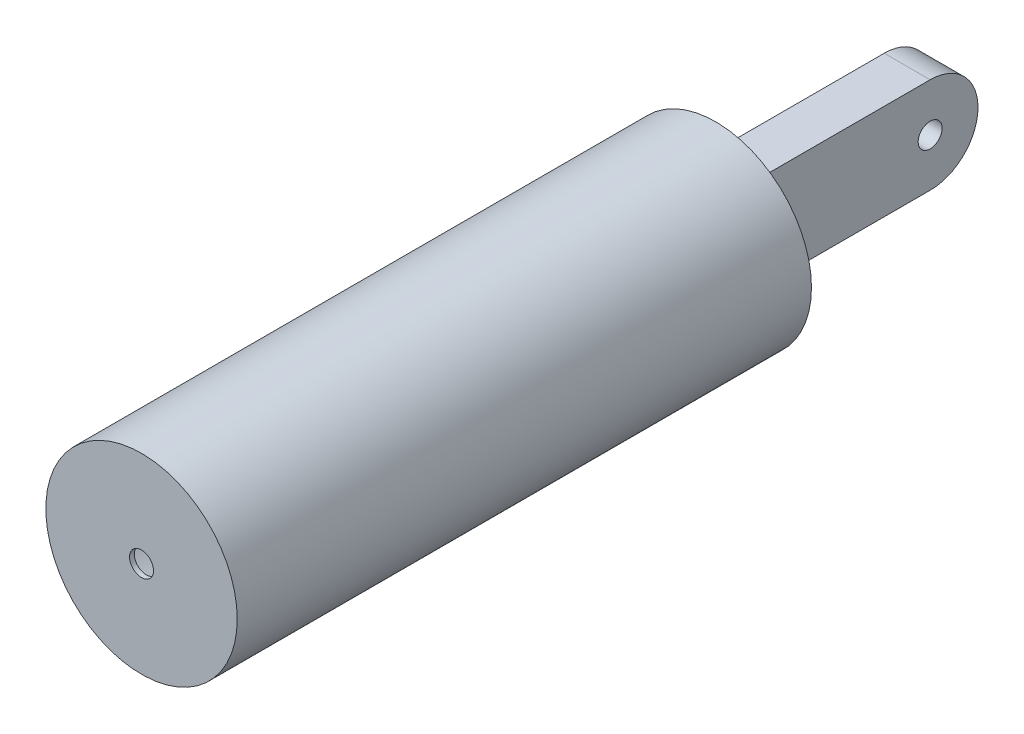
ISO-10303-21;
HEADER;
FILE_DESCRIPTION(('STEP AP214'),'2;1');
FILE_NAME('part.step','',(''),(''),'','','');
FILE_SCHEMA(('AUTOMOTIVE_DESIGN { 1 0 10303 214 1 1 1 1 }'));
ENDSEC;
DATA;
#1=APPLICATION_CONTEXT('core data for automotive mechanical design processes');
#2=APPLICATION_PROTOCOL_DEFINITION('international standard','automotive_design',2000,#1);
#3=PRODUCT_CONTEXT('',#1,'mechanical');
#4=PRODUCT('Part','Part','',(#3));
#5=PRODUCT_RELATED_PRODUCT_CATEGORY('part','',(#4));
#6=PRODUCT_DEFINITION_FORMATION('','',#4);
#7=PRODUCT_DEFINITION_CONTEXT('part definition',#1,'design');
#8=PRODUCT_DEFINITION('design','',#6,#7);
#9=PRODUCT_DEFINITION_SHAPE('','',#8);
#10=(LENGTH_UNIT() NAMED_UNIT(*) SI_UNIT(.MILLI.,.METRE.));
#11=(NAMED_UNIT(*) PLANE_ANGLE_UNIT() SI_UNIT($,.RADIAN.));
#12=(NAMED_UNIT(*) SI_UNIT($,.STERADIAN.) SOLID_ANGLE_UNIT());
#13=UNCERTAINTY_MEASURE_WITH_UNIT(LENGTH_MEASURE(1.E-05),#10,'distance_accuracy_value','');
#14=(GEOMETRIC_REPRESENTATION_CONTEXT(3) GLOBAL_UNCERTAINTY_ASSIGNED_CONTEXT((#13)) GLOBAL_UNIT_ASSIGNED_CONTEXT((#10,
#11,#12)) REPRESENTATION_CONTEXT('',''));
#15=CARTESIAN_POINT('',(0.,0.,0.));
#16=DIRECTION('',(0.,0.,1.));
#17=DIRECTION('',(1.,0.,0.));
#18=AXIS2_PLACEMENT_3D('',#15,#16,#17);
#19=CARTESIAN_POINT('',(0.,0.,-29.5));
#20=DIRECTION('',(0.,0.,1.));
#21=DIRECTION('',(1.,0.,0.));
#22=AXIS2_PLACEMENT_3D('',#19,#20,#21);
#23=CYLINDRICAL_SURFACE('',#22,9.75);
#24=CARTESIAN_POINT('',(0.,0.,-29.5));
#25=DIRECTION('',(0.,0.,1.));
#26=DIRECTION('',(1.,0.,0.));
#27=AXIS2_PLACEMENT_3D('',#24,#25,#26);
#28=CIRCLE('',#27,9.75);
#29=CARTESIAN_POINT('',(9.75,0.,-29.5));
#30=VERTEX_POINT('',#29);
#31=EDGE_CURVE('E118',#30,#30,#28,.T.);
#32=CARTESIAN_POINT('',(0.,0.,29.5));
#33=DIRECTION('',(0.,0.,1.));
#34=DIRECTION('',(1.,0.,0.));
#35=AXIS2_PLACEMENT_3D('',#32,#33,#34);
#36=CIRCLE('',#35,9.75);
#37=CARTESIAN_POINT('',(9.75,0.,29.5));
#38=VERTEX_POINT('',#37);
#39=EDGE_CURVE('E121',#38,#38,#36,.T.);
#40=CARTESIAN_POINT('',(9.75,0.,-29.5));
#41=CARTESIAN_POINT('',(9.75,0.,-28.8854166666667));
#42=CARTESIAN_POINT('',(9.75,0.,-28.2708333333333));
#43=CARTESIAN_POINT('',(9.75,0.,-27.0416666666667));
#44=CARTESIAN_POINT('',(9.75,0.,-26.4270833333333));
#45=CARTESIAN_POINT('',(9.75,0.,-25.1979166666667));
#46=CARTESIAN_POINT('',(9.75,0.,-24.5833333333333));
#47=CARTESIAN_POINT('',(9.75,0.,-23.3541666666667));
#48=CARTESIAN_POINT('',(9.75,0.,-22.7395833333333));
#49=CARTESIAN_POINT('',(9.75,0.,-21.5104166666667));
#50=CARTESIAN_POINT('',(9.75,0.,-20.8958333333333));
#51=CARTESIAN_POINT('',(9.75,0.,-19.6666666666667));
#52=CARTESIAN_POINT('',(9.75,0.,-19.0520833333333));
#53=CARTESIAN_POINT('',(9.75,0.,-17.8229166666667));
#54=CARTESIAN_POINT('',(9.75,0.,-17.2083333333333));
#55=CARTESIAN_POINT('',(9.75,0.,-15.9791666666667));
#56=CARTESIAN_POINT('',(9.75,0.,-15.3645833333333));
#57=CARTESIAN_POINT('',(9.75,0.,-14.1354166666667));
#58=CARTESIAN_POINT('',(9.75,0.,-13.5208333333333));
#59=CARTESIAN_POINT('',(9.75,0.,-12.2916666666667));
#60=CARTESIAN_POINT('',(9.75,0.,-11.6770833333333));
#61=CARTESIAN_POINT('',(9.75,0.,-10.4479166666667));
#62=CARTESIAN_POINT('',(9.75,0.,-9.83333333333333));
#63=CARTESIAN_POINT('',(9.75,0.,-8.60416666666667));
#64=CARTESIAN_POINT('',(9.75,0.,-7.98958333333333));
#65=CARTESIAN_POINT('',(9.75,0.,-6.76041666666667));
#66=CARTESIAN_POINT('',(9.75,0.,-6.14583333333333));
#67=CARTESIAN_POINT('',(9.75,0.,-4.91666666666667));
#68=CARTESIAN_POINT('',(9.75,0.,-4.30208333333333));
#69=CARTESIAN_POINT('',(9.75,0.,-3.07291666666667));
#70=CARTESIAN_POINT('',(9.75,0.,-2.45833333333333));
#71=CARTESIAN_POINT('',(9.75,0.,-1.22916666666667));
#72=CARTESIAN_POINT('',(9.75,0.,-0.614583333333334));
#73=CARTESIAN_POINT('',(9.75,0.,0.614583333333332));
#74=CARTESIAN_POINT('',(9.75,0.,1.22916666666666));
#75=CARTESIAN_POINT('',(9.75,0.,2.45833333333333));
#76=CARTESIAN_POINT('',(9.75,0.,3.07291666666666));
#77=CARTESIAN_POINT('',(9.75,0.,4.30208333333333));
#78=CARTESIAN_POINT('',(9.75,0.,4.91666666666667));
#79=CARTESIAN_POINT('',(9.75,0.,6.14583333333333));
#80=CARTESIAN_POINT('',(9.75,0.,6.76041666666666));
#81=CARTESIAN_POINT('',(9.75,0.,7.98958333333333));
#82=CARTESIAN_POINT('',(9.75,0.,8.60416666666667));
#83=CARTESIAN_POINT('',(9.75,0.,9.83333333333333));
#84=CARTESIAN_POINT('',(9.75,0.,10.4479166666667));
#85=CARTESIAN_POINT('',(9.75,0.,11.6770833333333));
#86=CARTESIAN_POINT('',(9.75,0.,12.2916666666667));
#87=CARTESIAN_POINT('',(9.75,0.,13.5208333333333));
#88=CARTESIAN_POINT('',(9.75,0.,14.1354166666667));
#89=CARTESIAN_POINT('',(9.75,0.,15.3645833333333));
#90=CARTESIAN_POINT('',(9.75,0.,15.9791666666667));
#91=CARTESIAN_POINT('',(9.75,0.,17.2083333333333));
#92=CARTESIAN_POINT('',(9.75,0.,17.8229166666667));
#93=CARTESIAN_POINT('',(9.75,0.,19.0520833333333));
#94=CARTESIAN_POINT('',(9.75,0.,19.6666666666667));
#95=CARTESIAN_POINT('',(9.75,0.,20.8958333333333));
#96=CARTESIAN_POINT('',(9.75,0.,21.5104166666667));
#97=CARTESIAN_POINT('',(9.75,0.,22.7395833333333));
#98=CARTESIAN_POINT('',(9.75,0.,23.3541666666667));
#99=CARTESIAN_POINT('',(9.75,0.,24.5833333333333));
#100=CARTESIAN_POINT('',(9.75,0.,25.1979166666667));
#101=CARTESIAN_POINT('',(9.75,0.,26.4270833333333));
#102=CARTESIAN_POINT('',(9.75,0.,27.0416666666667));
#103=CARTESIAN_POINT('',(9.75,0.,28.2708333333333));
#104=CARTESIAN_POINT('',(9.75,0.,28.8854166666667));
#105=CARTESIAN_POINT('',(9.75,0.,29.5));
#106=B_SPLINE_CURVE_WITH_KNOTS('',3,(#40,#41,#42,#43,#44,#45,#46,#47,#48,#49,#50,#51,#52,#53,
#54,#55,#56,#57,#58,#59,#60,#61,#62,#63,#64,#65,#66,#67,#68,#69,#70,#71,#72,#73,#74,#75,#76,#77,
#78,#79,#80,#81,#82,#83,#84,#85,#86,#87,#88,#89,#90,#91,#92,#93,#94,#95,#96,#97,#98,#99,#100,
#101,#102,#103,#104,#105),.UNSPECIFIED.,.F.,.F.,(4,2,2,2,2,2,2,2,2,2,2,2,2,2,2,2,2,2,2,2,2,2,2,
2,2,2,2,2,2,2,2,2,4),(0.,1.84375,3.6875,5.53125,7.375,9.21875,11.0625,12.90625,14.75,16.59375,
18.4375,20.28125,22.125,23.96875,25.8125,27.65625,29.5,31.34375,33.1875,35.03125,36.875,
38.71875,40.5625,42.40625,44.25,46.09375,47.9375,49.78125,51.625,53.46875,55.3125,57.15625,59.),.UNSPECIFIED.);
#107=EDGE_CURVE('BSEAM38',#30,#38,#106,.T.);
#108=ORIENTED_EDGE('',*,*,#31,.F.);
#109=ORIENTED_EDGE('',*,*,#39,.T.);
#110=ORIENTED_EDGE('',*,*,#107,.T.);
#111=ORIENTED_EDGE('',*,*,#107,.F.);
#112=EDGE_LOOP('',(#108,#110,#109,#111));
#113=FACE_BOUND('',#112,.T.);
#114=ADVANCED_FACE('F38',(#113),#23,.F.);
#115=CARTESIAN_POINT('',(0.,0.,-29.5));
#116=DIRECTION('',(0.,0.,1.));
#117=DIRECTION('',(1.,0.,0.));
#118=AXIS2_PLACEMENT_3D('',#115,#116,#117);
#119=PLANE('',#118);
#120=ORIENTED_EDGE('',*,*,#31,.T.);
#121=EDGE_LOOP('',(#120));
#122=FACE_BOUND('',#121,.T.);
#123=ADVANCED_FACE('F141',(#122),#119,.T.);
#124=CARTESIAN_POINT('',(0.,0.,29.5));
#125=DIRECTION('',(0.,0.,1.));
#126=DIRECTION('',(1.,0.,0.));
#127=AXIS2_PLACEMENT_3D('',#124,#125,#126);
#128=PLANE('',#127);
#129=CARTESIAN_POINT('',(0.,0.,29.5));
#130=DIRECTION('',(0.,0.,1.));
#131=DIRECTION('',(1.,0.,0.));
#132=AXIS2_PLACEMENT_3D('',#129,#130,#131);
#133=CIRCLE('',#132,1.25);
#134=CARTESIAN_POINT('',(1.25,0.,29.5));
#135=VERTEX_POINT('',#134);
#136=EDGE_CURVE('E117',#135,#135,#133,.T.);
#137=ORIENTED_EDGE('',*,*,#136,.T.);
#138=EDGE_LOOP('',(#137));
#139=FACE_BOUND('',#138,.T.);
#140=ORIENTED_EDGE('',*,*,#39,.F.);
#141=EDGE_LOOP('',(#140));
#142=FACE_BOUND('',#141,.T.);
#143=ADVANCED_FACE('F128',(#139,#142),#128,.F.);
#144=CARTESIAN_POINT('',(0.,0.,29.));
#145=DIRECTION('',(0.,0.,1.));
#146=DIRECTION('',(1.,0.,0.));
#147=AXIS2_PLACEMENT_3D('',#144,#145,#146);
#148=CYLINDRICAL_SURFACE('',#147,1.25);
#149=CARTESIAN_POINT('',(0.,0.,30.));
#150=DIRECTION('',(0.,0.,1.));
#151=DIRECTION('',(1.,0.,0.));
#152=AXIS2_PLACEMENT_3D('',#149,#150,#151);
#153=CIRCLE('',#152,1.25);
#154=CARTESIAN_POINT('',(1.25,0.,30.));
#155=VERTEX_POINT('',#154);
#156=EDGE_CURVE('E114',#155,#155,#153,.T.);
#157=ORIENTED_EDGE('',*,*,#156,.T.);
#158=EDGE_LOOP('',(#157));
#159=FACE_BOUND('',#158,.T.);
#160=ORIENTED_EDGE('',*,*,#136,.F.);
#161=EDGE_LOOP('',(#160));
#162=FACE_BOUND('',#161,.T.);
#163=ADVANCED_FACE('F131',(#159,#162),#148,.F.);
#164=CARTESIAN_POINT('',(0.,0.,30.));
#165=DIRECTION('',(0.,0.,-1.));
#166=DIRECTION('',(-1.,0.,0.));
#167=AXIS2_PLACEMENT_3D('',#164,#165,#166);
#168=CYLINDRICAL_SURFACE('',#167,10.);
#169=CARTESIAN_POINT('',(0.,0.,30.));
#170=DIRECTION('',(0.,0.,1.));
#171=DIRECTION('',(1.,0.,0.));
#172=AXIS2_PLACEMENT_3D('',#169,#170,#171);
#173=CIRCLE('',#172,10.);
#174=CARTESIAN_POINT('',(10.,0.,30.));
#175=VERTEX_POINT('',#174);
#176=EDGE_CURVE('E11',#175,#175,#173,.T.);
#177=ORIENTED_EDGE('',*,*,#176,.F.);
#178=EDGE_LOOP('',(#177));
#179=FACE_BOUND('',#178,.T.);
#180=CARTESIAN_POINT('',(0.,0.,-30.));
#181=DIRECTION('',(0.,0.,1.));
#182=DIRECTION('',(1.,0.,0.));
#183=AXIS2_PLACEMENT_3D('',#180,#181,#182);
#184=CIRCLE('',#183,10.);
#185=CARTESIAN_POINT('',(10.,0.,-30.));
#186=VERTEX_POINT('',#185);
#187=EDGE_CURVE('E47',#186,#186,#184,.T.);
#188=ORIENTED_EDGE('',*,*,#187,.T.);
#189=EDGE_LOOP('',(#188));
#190=FACE_BOUND('',#189,.T.);
#191=ADVANCED_FACE('F40',(#179,#190),#168,.T.);
#192=CARTESIAN_POINT('',(0.,0.,30.));
#193=DIRECTION('',(0.,0.,1.));
#194=DIRECTION('',(1.,0.,0.));
#195=AXIS2_PLACEMENT_3D('',#192,#193,#194);
#196=PLANE('',#195);
#197=ORIENTED_EDGE('',*,*,#156,.F.);
#198=EDGE_LOOP('',(#197));
#199=FACE_BOUND('',#198,.T.);
#200=ORIENTED_EDGE('',*,*,#176,.T.);
#201=EDGE_LOOP('',(#200));
#202=FACE_BOUND('',#201,.T.);
#203=ADVANCED_FACE('F139',(#199,#202),#196,.T.);
#204=CARTESIAN_POINT('',(0.,0.,-30.));
#205=DIRECTION('',(0.,0.,1.));
#206=DIRECTION('',(1.,0.,0.));
#207=AXIS2_PLACEMENT_3D('',#204,#205,#206);
#208=PLANE('',#207);
#209=DIRECTION('',(-1.,0.,0.));
#210=VECTOR('',#209,1.);
#211=CARTESIAN_POINT('',(2.4,-5.,-30.));
#212=LINE('',#211,#210);
#213=CARTESIAN_POINT('',(2.4,-5.,-30.));
#214=VERTEX_POINT('',#213);
#215=CARTESIAN_POINT('',(-2.4,-5.,-30.));
#216=VERTEX_POINT('',#215);
#217=EDGE_CURVE('E60',#214,#216,#212,.T.);
#218=ORIENTED_EDGE('',*,*,#217,.F.);
#219=DIRECTION('',(0.,-1.,0.));
#220=VECTOR('',#219,1.);
#221=CARTESIAN_POINT('',(2.4,5.,-30.));
#222=LINE('',#221,#220);
#223=CARTESIAN_POINT('',(2.4,5.,-30.));
#224=VERTEX_POINT('',#223);
#225=EDGE_CURVE('E55',#224,#214,#222,.T.);
#226=ORIENTED_EDGE('',*,*,#225,.F.);
#227=DIRECTION('',(-1.,0.,0.));
#228=VECTOR('',#227,1.);
#229=CARTESIAN_POINT('',(2.4,5.,-30.));
#230=LINE('',#229,#228);
#231=CARTESIAN_POINT('',(-2.4,5.,-30.));
#232=VERTEX_POINT('',#231);
#233=EDGE_CURVE('E112',#224,#232,#230,.T.);
#234=ORIENTED_EDGE('',*,*,#233,.T.);
#235=DIRECTION('',(0.,-1.,0.));
#236=VECTOR('',#235,1.);
#237=CARTESIAN_POINT('',(-2.4,5.,-30.));
#238=LINE('',#237,#236);
#239=EDGE_CURVE('E105',#232,#216,#238,.T.);
#240=ORIENTED_EDGE('',*,*,#239,.T.);
#241=EDGE_LOOP('',(#218,#226,#234,#240));
#242=FACE_BOUND('',#241,.T.);
#243=ORIENTED_EDGE('',*,*,#187,.F.);
#244=EDGE_LOOP('',(#243));
#245=FACE_BOUND('',#244,.T.);
#246=ADVANCED_FACE('F156',(#242,#245),#208,.F.);
#247=CARTESIAN_POINT('',(2.4,5.,-30.));
#248=DIRECTION('',(0.,-1.,0.));
#249=DIRECTION('',(0.,0.,-1.));
#250=AXIS2_PLACEMENT_3D('',#247,#248,#249);
#251=PLANE('',#250);
#252=DIRECTION('',(0.,0.,1.));
#253=VECTOR('',#252,1.);
#254=CARTESIAN_POINT('',(-2.4,5.,-30.));
#255=LINE('',#254,#253);
#256=CARTESIAN_POINT('',(-2.4,5.,-50.));
#257=VERTEX_POINT('',#256);
#258=EDGE_CURVE('E102',#257,#232,#255,.T.);
#259=ORIENTED_EDGE('',*,*,#258,.T.);
#260=ORIENTED_EDGE('',*,*,#233,.F.);
#261=DIRECTION('',(0.,0.,1.));
#262=VECTOR('',#261,1.);
#263=CARTESIAN_POINT('',(2.4,5.,-30.));
#264=LINE('',#263,#262);
#265=CARTESIAN_POINT('',(2.4,5.,-50.));
#266=VERTEX_POINT('',#265);
#267=EDGE_CURVE('E109',#266,#224,#264,.T.);
#268=ORIENTED_EDGE('',*,*,#267,.F.);
#269=DIRECTION('',(-1.,0.,0.));
#270=VECTOR('',#269,1.);
#271=CARTESIAN_POINT('',(2.4,5.,-50.));
#272=LINE('',#271,#270);
#273=EDGE_CURVE('E93',#266,#257,#272,.T.);
#274=ORIENTED_EDGE('',*,*,#273,.T.);
#275=EDGE_LOOP('',(#259,#260,#268,#274));
#276=FACE_BOUND('',#275,.T.);
#277=ADVANCED_FACE('F159',(#276),#251,.F.);
#278=CARTESIAN_POINT('',(2.4,-5.,-50.));
#279=DIRECTION('',(0.,1.,0.));
#280=DIRECTION('',(0.,0.,1.));
#281=AXIS2_PLACEMENT_3D('',#278,#279,#280);
#282=PLANE('',#281);
#283=DIRECTION('',(0.,0.,-1.));
#284=VECTOR('',#283,1.);
#285=CARTESIAN_POINT('',(-2.4,-5.,-50.));
#286=LINE('',#285,#284);
#287=CARTESIAN_POINT('',(-2.4,-5.,-50.));
#288=VERTEX_POINT('',#287);
#289=EDGE_CURVE('E90',#216,#288,#286,.T.);
#290=ORIENTED_EDGE('',*,*,#289,.T.);
#291=DIRECTION('',(-1.,0.,0.));
#292=VECTOR('',#291,1.);
#293=CARTESIAN_POINT('',(2.4,-5.,-50.));
#294=LINE('',#293,#292);
#295=CARTESIAN_POINT('',(2.4,-5.,-50.));
#296=VERTEX_POINT('',#295);
#297=EDGE_CURVE('E87',#296,#288,#294,.T.);
#298=ORIENTED_EDGE('',*,*,#297,.F.);
#299=DIRECTION('',(0.,0.,-1.));
#300=VECTOR('',#299,1.);
#301=CARTESIAN_POINT('',(2.4,-5.,-50.));
#302=LINE('',#301,#300);
#303=EDGE_CURVE('E78',#214,#296,#302,.T.);
#304=ORIENTED_EDGE('',*,*,#303,.F.);
#305=ORIENTED_EDGE('',*,*,#217,.T.);
#306=EDGE_LOOP('',(#290,#298,#304,#305));
#307=FACE_BOUND('',#306,.T.);
#308=ADVANCED_FACE('F88',(#307),#282,.F.);
#309=CARTESIAN_POINT('',(2.4,0.,-50.));
#310=DIRECTION('',(-1.,0.,0.));
#311=DIRECTION('',(0.,0.,1.));
#312=AXIS2_PLACEMENT_3D('',#309,#310,#311);
#313=CYLINDRICAL_SURFACE('',#312,5.);
#314=CARTESIAN_POINT('',(-2.4,0.,-50.));
#315=DIRECTION('',(1.,0.,0.));
#316=DIRECTION('',(0.,0.,-1.));
#317=AXIS2_PLACEMENT_3D('',#314,#315,#316);
#318=CIRCLE('',#317,5.);
#319=EDGE_CURVE('E108',#288,#257,#318,.T.);
#320=ORIENTED_EDGE('',*,*,#319,.T.);
#321=ORIENTED_EDGE('',*,*,#273,.F.);
#322=CARTESIAN_POINT('',(2.4,0.,-50.));
#323=DIRECTION('',(1.,0.,0.));
#324=DIRECTION('',(0.,0.,-1.));
#325=AXIS2_PLACEMENT_3D('',#322,#323,#324);
#326=CIRCLE('',#325,5.);
#327=EDGE_CURVE('E82',#296,#266,#326,.T.);
#328=ORIENTED_EDGE('',*,*,#327,.F.);
#329=ORIENTED_EDGE('',*,*,#297,.T.);
#330=EDGE_LOOP('',(#320,#321,#328,#329));
#331=FACE_BOUND('',#330,.T.);
#332=ADVANCED_FACE('F95',(#331),#313,.T.);
#333=CARTESIAN_POINT('',(2.4,0.,-50.));
#334=DIRECTION('',(1.,0.,0.));
#335=DIRECTION('',(0.,0.,-1.));
#336=AXIS2_PLACEMENT_3D('',#333,#334,#335);
#337=PLANE('',#336);
#338=CARTESIAN_POINT('',(2.4,0.,-50.));
#339=DIRECTION('',(1.,0.,0.));
#340=DIRECTION('',(0.,0.,-1.));
#341=AXIS2_PLACEMENT_3D('',#338,#339,#340);
#342=CIRCLE('',#341,1.25);
#343=CARTESIAN_POINT('',(2.4,0.,-51.25));
#344=VERTEX_POINT('',#343);
#345=EDGE_CURVE('E189',#344,#344,#342,.T.);
#346=ORIENTED_EDGE('',*,*,#345,.F.);
#347=EDGE_LOOP('',(#346));
#348=FACE_BOUND('',#347,.T.);
#349=ORIENTED_EDGE('',*,*,#267,.T.);
#350=ORIENTED_EDGE('',*,*,#225,.T.);
#351=ORIENTED_EDGE('',*,*,#303,.T.);
#352=ORIENTED_EDGE('',*,*,#327,.T.);
#353=EDGE_LOOP('',(#349,#350,#351,#352));
#354=FACE_BOUND('',#353,.T.);
#355=ADVANCED_FACE('F80',(#348,#354),#337,.T.);
#356=CARTESIAN_POINT('',(-2.4,0.,-50.));
#357=DIRECTION('',(1.,0.,0.));
#358=DIRECTION('',(0.,0.,-1.));
#359=AXIS2_PLACEMENT_3D('',#356,#357,#358);
#360=PLANE('',#359);
#361=CARTESIAN_POINT('',(-2.4,0.,-50.));
#362=DIRECTION('',(1.,0.,0.));
#363=DIRECTION('',(0.,0.,-1.));
#364=AXIS2_PLACEMENT_3D('',#361,#362,#363);
#365=CIRCLE('',#364,1.25);
#366=CARTESIAN_POINT('',(-2.4,0.,-51.25));
#367=VERTEX_POINT('',#366);
#368=EDGE_CURVE('E42',#367,#367,#365,.T.);
#369=ORIENTED_EDGE('',*,*,#368,.T.);
#370=EDGE_LOOP('',(#369));
#371=FACE_BOUND('',#370,.T.);
#372=ORIENTED_EDGE('',*,*,#258,.F.);
#373=ORIENTED_EDGE('',*,*,#319,.F.);
#374=ORIENTED_EDGE('',*,*,#289,.F.);
#375=ORIENTED_EDGE('',*,*,#239,.F.);
#376=EDGE_LOOP('',(#372,#373,#374,#375));
#377=FACE_BOUND('',#376,.T.);
#378=ADVANCED_FACE('F174',(#371,#377),#360,.F.);
#379=CARTESIAN_POINT('',(-7.6,0.,-50.));
#380=DIRECTION('',(1.,0.,0.));
#381=DIRECTION('',(0.,0.,-1.));
#382=AXIS2_PLACEMENT_3D('',#379,#380,#381);
#383=CYLINDRICAL_SURFACE('',#382,1.25);
#384=ORIENTED_EDGE('',*,*,#345,.T.);
#385=EDGE_LOOP('',(#384));
#386=FACE_BOUND('',#385,.T.);
#387=ORIENTED_EDGE('',*,*,#368,.F.);
#388=EDGE_LOOP('',(#387));
#389=FACE_BOUND('',#388,.T.);
#390=ADVANCED_FACE('F177',(#386,#389),#383,.F.);
#391=CLOSED_SHELL('',(#114,#123,#143,#163,#191,#203,#246,#277,#308,#332,#355,#378,#390));
#392=MANIFOLD_SOLID_BREP('B2',#391);
#393=ADVANCED_BREP_SHAPE_REPRESENTATION('',(#18,#392),#14);
#394=SHAPE_DEFINITION_REPRESENTATION(#9,#393);
ENDSEC;
END-ISO-10303-21;
